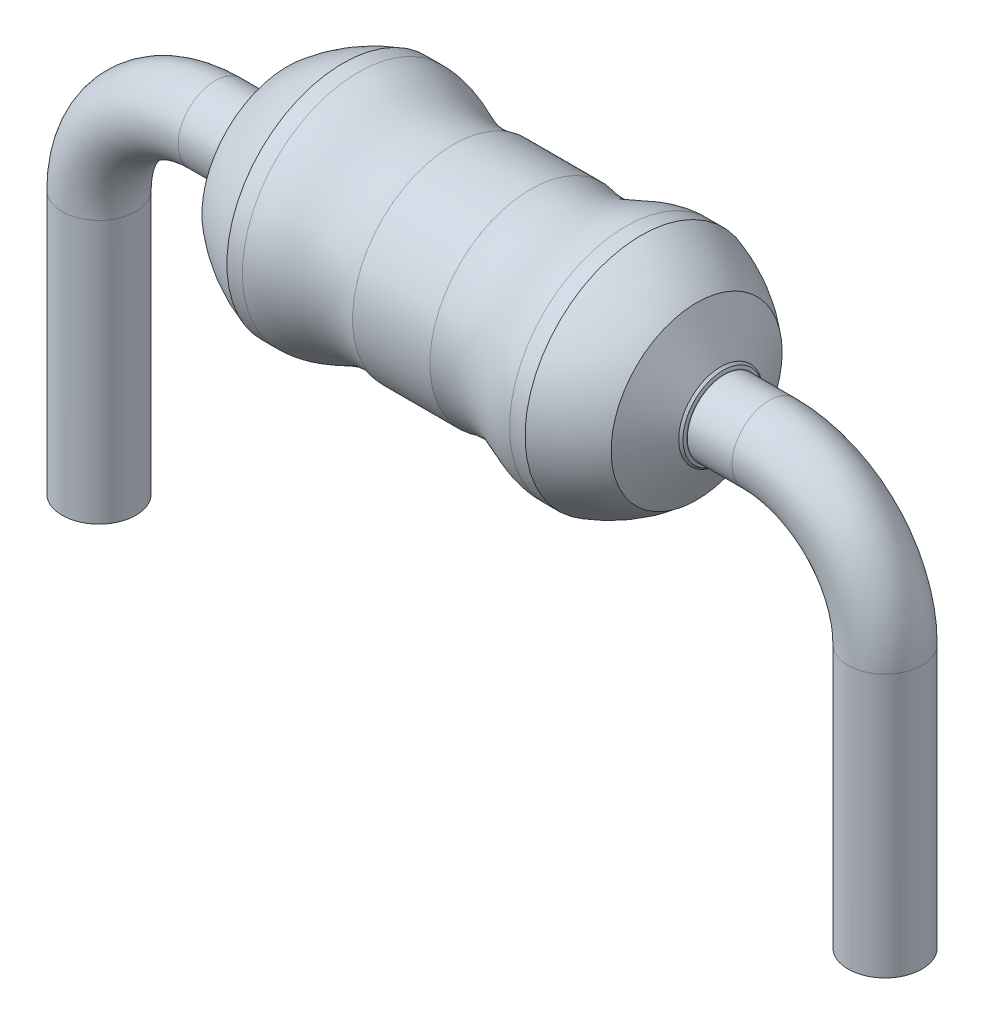
ISO-10303-21;
HEADER;
FILE_DESCRIPTION(('STEP AP214'),'2;1');
FILE_NAME('part.step','',(''),(''),'','','');
FILE_SCHEMA(('AUTOMOTIVE_DESIGN { 1 0 10303 214 1 1 1 1 }'));
ENDSEC;
DATA;
#1=APPLICATION_CONTEXT('core data for automotive mechanical design processes');
#2=APPLICATION_PROTOCOL_DEFINITION('international standard','automotive_design',2000,#1);
#3=PRODUCT_CONTEXT('',#1,'mechanical');
#4=PRODUCT('Part','Part','',(#3));
#5=PRODUCT_RELATED_PRODUCT_CATEGORY('part','',(#4));
#6=PRODUCT_DEFINITION_FORMATION('','',#4);
#7=PRODUCT_DEFINITION_CONTEXT('part definition',#1,'design');
#8=PRODUCT_DEFINITION('design','',#6,#7);
#9=PRODUCT_DEFINITION_SHAPE('','',#8);
#10=(LENGTH_UNIT() NAMED_UNIT(*) SI_UNIT(.MILLI.,.METRE.));
#11=(NAMED_UNIT(*) PLANE_ANGLE_UNIT() SI_UNIT($,.RADIAN.));
#12=(NAMED_UNIT(*) SI_UNIT($,.STERADIAN.) SOLID_ANGLE_UNIT());
#13=UNCERTAINTY_MEASURE_WITH_UNIT(LENGTH_MEASURE(1.E-05),#10,'distance_accuracy_value','');
#14=(GEOMETRIC_REPRESENTATION_CONTEXT(3) GLOBAL_UNCERTAINTY_ASSIGNED_CONTEXT((#13)) GLOBAL_UNIT_ASSIGNED_CONTEXT((#10,
#11,#12)) REPRESENTATION_CONTEXT('',''));
#15=CARTESIAN_POINT('',(0.,0.,0.));
#16=DIRECTION('',(0.,0.,1.));
#17=DIRECTION('',(1.,0.,0.));
#18=AXIS2_PLACEMENT_3D('',#15,#16,#17);
#19=CARTESIAN_POINT('',(-0.25,0.651526231351182,0.));
#20=CARTESIAN_POINT('',(-0.540627106576313,0.576942290694356,0.));
#21=CARTESIAN_POINT('',(-0.629755247804834,0.753539039726722,0.));
#22=CARTESIAN_POINT('',(-0.863389621188297,0.750000000000002,0.));
#23=B_SPLINE_CURVE_WITH_KNOTS('',3,(#19,#20,#21,#22),.UNSPECIFIED.,.F.,.F.,(4,4),
(0.141421900341974,1.),.UNSPECIFIED.);
#24=CARTESIAN_POINT('',(26.5291584484715,0.,0.));
#25=DIRECTION('',(1.,0.,0.));
#26=AXIS1_PLACEMENT('',#24,#25);
#27=SURFACE_OF_REVOLUTION('',#23,#26);
#28=CARTESIAN_POINT('',(-0.863389621188298,0.,0.));
#29=DIRECTION('',(1.,0.,0.));
#30=DIRECTION('',(0.,0.,-1.));
#31=AXIS2_PLACEMENT_3D('',#28,#29,#30);
#32=CIRCLE('',#31,0.75);
#33=CARTESIAN_POINT('',(-0.863389621188298,0.,-0.75));
#34=VERTEX_POINT('',#33);
#35=EDGE_CURVE('E53',#34,#34,#32,.T.);
#36=ORIENTED_EDGE('',*,*,#35,.T.);
#37=EDGE_LOOP('',(#36));
#38=FACE_BOUND('',#37,.T.);
#39=CARTESIAN_POINT('',(-0.25,0.,0.));
#40=DIRECTION('',(1.,0.,0.));
#41=DIRECTION('',(0.,0.,-1.));
#42=AXIS2_PLACEMENT_3D('',#39,#40,#41);
#43=CIRCLE('',#42,0.651526231351182);
#44=CARTESIAN_POINT('',(-0.25,0.,-0.651526231351182));
#45=VERTEX_POINT('',#44);
#46=EDGE_CURVE('E86',#45,#45,#43,.T.);
#47=ORIENTED_EDGE('',*,*,#46,.F.);
#48=EDGE_LOOP('',(#47));
#49=FACE_BOUND('',#48,.T.);
#50=ADVANCED_FACE('F33',(#38,#49),#27,.F.);
#51=CARTESIAN_POINT('',(26.5291584484715,0.,0.));
#52=DIRECTION('',(1.,0.,0.));
#53=DIRECTION('',(0.,0.,-1.));
#54=AXIS2_PLACEMENT_3D('',#51,#52,#53);
#55=CYLINDRICAL_SURFACE('',#54,0.75);
#56=CARTESIAN_POINT('',(-0.963389621188297,0.,0.));
#57=DIRECTION('',(1.,0.,0.));
#58=DIRECTION('',(0.,0.,-1.));
#59=AXIS2_PLACEMENT_3D('',#56,#57,#58);
#60=CIRCLE('',#59,0.75);
#61=CARTESIAN_POINT('',(-0.963389621188297,0.,-0.75));
#62=VERTEX_POINT('',#61);
#63=EDGE_CURVE('E56',#62,#62,#60,.T.);
#64=ORIENTED_EDGE('',*,*,#63,.T.);
#65=EDGE_LOOP('',(#64));
#66=FACE_BOUND('',#65,.T.);
#67=ORIENTED_EDGE('',*,*,#35,.F.);
#68=EDGE_LOOP('',(#67));
#69=FACE_BOUND('',#68,.T.);
#70=ADVANCED_FACE('F143',(#66,#69),#55,.T.);
#71=CARTESIAN_POINT('',(-0.645621937319628,0.,0.));
#72=DIRECTION('',(1.,0.,0.));
#73=DIRECTION('',(0.,0.,-1.));
#74=AXIS2_PLACEMENT_3D('',#71,#72,#73);
#75=DEGENERATE_TOROIDAL_SURFACE('',#74,0.253369807764226,1.05248623366013,.F.);
#76=CARTESIAN_POINT('',(-1.32233238501918,0.,0.));
#77=DIRECTION('',(1.,0.,0.));
#78=DIRECTION('',(0.,0.,-1.));
#79=AXIS2_PLACEMENT_3D('',#76,#77,#78);
#80=CIRCLE('',#79,0.552725870191158);
#81=CARTESIAN_POINT('',(-1.32233238501918,0.,-0.552725870191158));
#82=VERTEX_POINT('',#81);
#83=EDGE_CURVE('E59',#82,#82,#80,.T.);
#84=ORIENTED_EDGE('',*,*,#83,.T.);
#85=EDGE_LOOP('',(#84));
#86=FACE_BOUND('',#85,.T.);
#87=ORIENTED_EDGE('',*,*,#63,.F.);
#88=EDGE_LOOP('',(#87));
#89=FACE_BOUND('',#88,.T.);
#90=ADVANCED_FACE('F139',(#86,#89),#75,.F.);
#91=CARTESIAN_POINT('',(-1.32233238501918,0.,0.));
#92=DIRECTION('',(1.,0.,0.));
#93=DIRECTION('',(0.,0.,-1.));
#94=AXIS2_PLACEMENT_3D('',#91,#92,#93);
#95=CONICAL_SURFACE('',#94,0.552725870191158,1.06709591324831);
#96=CARTESIAN_POINT('',(-1.4775165691903,0.,0.));
#97=DIRECTION('',(1.,0.,0.));
#98=DIRECTION('',(0.,0.,-1.));
#99=AXIS2_PLACEMENT_3D('',#96,#97,#98);
#100=CIRCLE('',#99,0.271144690898735);
#101=CARTESIAN_POINT('',(-1.4775165691903,0.,-0.271144690898735));
#102=VERTEX_POINT('',#101);
#103=EDGE_CURVE('E62',#102,#102,#100,.T.);
#104=ORIENTED_EDGE('',*,*,#103,.T.);
#105=EDGE_LOOP('',(#104));
#106=FACE_BOUND('',#105,.T.);
#107=ORIENTED_EDGE('',*,*,#83,.F.);
#108=EDGE_LOOP('',(#107));
#109=FACE_BOUND('',#108,.T.);
#110=ADVANCED_FACE('F135',(#106,#109),#95,.T.);
#111=CARTESIAN_POINT('',(-1.78402789773097,0.,0.));
#112=DIRECTION('',(1.,0.,0.));
#113=DIRECTION('',(0.,0.,-1.));
#114=AXIS2_PLACEMENT_3D('',#111,#112,#113);
#115=TOROIDAL_SURFACE('',#114,0.623621218209544,0.467106943674412);
#116=CARTESIAN_POINT('',(-1.49253070357451,0.,0.));
#117=DIRECTION('',(1.,0.,0.));
#118=DIRECTION('',(0.,0.,-1.));
#119=AXIS2_PLACEMENT_3D('',#116,#117,#118);
#120=CIRCLE('',#119,0.25863042020532);
#121=CARTESIAN_POINT('',(-1.49253070357451,0.,-0.25863042020532));
#122=VERTEX_POINT('',#121);
#123=EDGE_CURVE('E65',#122,#122,#120,.T.);
#124=ORIENTED_EDGE('',*,*,#123,.T.);
#125=EDGE_LOOP('',(#124));
#126=FACE_BOUND('',#125,.T.);
#127=ORIENTED_EDGE('',*,*,#103,.F.);
#128=EDGE_LOOP('',(#127));
#129=FACE_BOUND('',#128,.T.);
#130=ADVANCED_FACE('F132',(#126,#129),#115,.F.);
#131=CARTESIAN_POINT('',(-1.49253070357451,0.,0.));
#132=DIRECTION('',(1.,0.,0.));
#133=DIRECTION('',(0.,0.,-1.));
#134=AXIS2_PLACEMENT_3D('',#131,#132,#133);
#135=CONICAL_SURFACE('',#134,0.25863042020532,1.18358948175056);
#136=CARTESIAN_POINT('',(-1.49925967375696,0.,0.));
#137=DIRECTION('',(-1.,0.,0.));
#138=DIRECTION('',(0.,0.,1.));
#139=AXIS2_PLACEMENT_3D('',#136,#137,#138);
#140=CIRCLE('',#139,0.242129496583466);
#141=CARTESIAN_POINT('',(-1.49925967375696,0.,0.242129496583466));
#142=VERTEX_POINT('',#141);
#143=EDGE_CURVE('E40',#142,#142,#140,.F.);
#144=ORIENTED_EDGE('',*,*,#143,.T.);
#145=EDGE_LOOP('',(#144));
#146=FACE_BOUND('',#145,.T.);
#147=ORIENTED_EDGE('',*,*,#123,.F.);
#148=EDGE_LOOP('',(#147));
#149=FACE_BOUND('',#148,.T.);
#150=ADVANCED_FACE('F128',(#146,#149),#135,.T.);
#151=CARTESIAN_POINT('',(1.5,0.,0.));
#152=DIRECTION('',(-1.,0.,0.));
#153=DIRECTION('',(0.,0.,1.));
#154=AXIS2_PLACEMENT_3D('',#151,#152,#153);
#155=CONICAL_SURFACE('',#154,0.240314052843878,1.18358948175056);
#156=CARTESIAN_POINT('',(1.49925967375696,0.,0.));
#157=DIRECTION('',(1.,0.,0.));
#158=DIRECTION('',(0.,0.,-1.));
#159=AXIS2_PLACEMENT_3D('',#156,#157,#158);
#160=CIRCLE('',#159,0.242129496583466);
#161=CARTESIAN_POINT('',(1.49925967375696,0.,-0.242129496583466));
#162=VERTEX_POINT('',#161);
#163=EDGE_CURVE('E44',#162,#162,#160,.F.);
#164=ORIENTED_EDGE('',*,*,#163,.T.);
#165=EDGE_LOOP('',(#164));
#166=FACE_BOUND('',#165,.T.);
#167=CARTESIAN_POINT('',(1.49253070357451,0.,0.));
#168=DIRECTION('',(1.,0.,0.));
#169=DIRECTION('',(0.,0.,-1.));
#170=AXIS2_PLACEMENT_3D('',#167,#168,#169);
#171=CIRCLE('',#170,0.25863042020532);
#172=CARTESIAN_POINT('',(1.49253070357451,0.,-0.25863042020532));
#173=VERTEX_POINT('',#172);
#174=EDGE_CURVE('E68',#173,#173,#171,.T.);
#175=ORIENTED_EDGE('',*,*,#174,.T.);
#176=EDGE_LOOP('',(#175));
#177=FACE_BOUND('',#176,.T.);
#178=ADVANCED_FACE('F124',(#166,#177),#155,.T.);
#179=CARTESIAN_POINT('',(1.78402789773097,0.,0.));
#180=DIRECTION('',(1.,0.,0.));
#181=DIRECTION('',(0.,0.,-1.));
#182=AXIS2_PLACEMENT_3D('',#179,#180,#181);
#183=TOROIDAL_SURFACE('',#182,0.623621218209544,0.467106943674412);
#184=CARTESIAN_POINT('',(1.4775165691903,0.,0.));
#185=DIRECTION('',(1.,0.,0.));
#186=DIRECTION('',(0.,0.,-1.));
#187=AXIS2_PLACEMENT_3D('',#184,#185,#186);
#188=CIRCLE('',#187,0.271144690898735);
#189=CARTESIAN_POINT('',(1.4775165691903,0.,-0.271144690898735));
#190=VERTEX_POINT('',#189);
#191=EDGE_CURVE('E71',#190,#190,#188,.T.);
#192=ORIENTED_EDGE('',*,*,#191,.T.);
#193=EDGE_LOOP('',(#192));
#194=FACE_BOUND('',#193,.T.);
#195=ORIENTED_EDGE('',*,*,#174,.F.);
#196=EDGE_LOOP('',(#195));
#197=FACE_BOUND('',#196,.T.);
#198=ADVANCED_FACE('F120',(#194,#197),#183,.F.);
#199=CARTESIAN_POINT('',(1.4775165691903,0.,0.));
#200=DIRECTION('',(-1.,0.,0.));
#201=DIRECTION('',(0.,0.,1.));
#202=AXIS2_PLACEMENT_3D('',#199,#200,#201);
#203=CONICAL_SURFACE('',#202,0.271144690898735,1.06709591324831);
#204=CARTESIAN_POINT('',(1.32233238501918,0.,0.));
#205=DIRECTION('',(1.,0.,0.));
#206=DIRECTION('',(0.,0.,-1.));
#207=AXIS2_PLACEMENT_3D('',#204,#205,#206);
#208=CIRCLE('',#207,0.552725870191158);
#209=CARTESIAN_POINT('',(1.32233238501918,0.,-0.552725870191158));
#210=VERTEX_POINT('',#209);
#211=EDGE_CURVE('E74',#210,#210,#208,.T.);
#212=ORIENTED_EDGE('',*,*,#211,.T.);
#213=EDGE_LOOP('',(#212));
#214=FACE_BOUND('',#213,.T.);
#215=ORIENTED_EDGE('',*,*,#191,.F.);
#216=EDGE_LOOP('',(#215));
#217=FACE_BOUND('',#216,.T.);
#218=ADVANCED_FACE('F116',(#214,#217),#203,.T.);
#219=CARTESIAN_POINT('',(0.645621937319628,0.,0.));
#220=DIRECTION('',(1.,0.,0.));
#221=DIRECTION('',(0.,0.,-1.));
#222=AXIS2_PLACEMENT_3D('',#219,#220,#221);
#223=DEGENERATE_TOROIDAL_SURFACE('',#222,0.253369807764226,1.05248623366013,.F.);
#224=CARTESIAN_POINT('',(0.963389621188297,0.,0.));
#225=DIRECTION('',(1.,0.,0.));
#226=DIRECTION('',(0.,0.,-1.));
#227=AXIS2_PLACEMENT_3D('',#224,#225,#226);
#228=CIRCLE('',#227,0.75);
#229=CARTESIAN_POINT('',(0.963389621188297,0.,-0.75));
#230=VERTEX_POINT('',#229);
#231=EDGE_CURVE('E77',#230,#230,#228,.T.);
#232=ORIENTED_EDGE('',*,*,#231,.T.);
#233=EDGE_LOOP('',(#232));
#234=FACE_BOUND('',#233,.T.);
#235=ORIENTED_EDGE('',*,*,#211,.F.);
#236=EDGE_LOOP('',(#235));
#237=FACE_BOUND('',#236,.T.);
#238=ADVANCED_FACE('F112',(#234,#237),#223,.F.);
#239=CARTESIAN_POINT('',(26.5291584484715,0.,0.));
#240=DIRECTION('',(1.,0.,0.));
#241=DIRECTION('',(0.,0.,-1.));
#242=AXIS2_PLACEMENT_3D('',#239,#240,#241);
#243=CYLINDRICAL_SURFACE('',#242,0.750000000000001);
#244=CARTESIAN_POINT('',(0.863389621188298,0.,0.));
#245=DIRECTION('',(1.,0.,0.));
#246=DIRECTION('',(0.,0.,-1.));
#247=AXIS2_PLACEMENT_3D('',#244,#245,#246);
#248=CIRCLE('',#247,0.750000000000001);
#249=CARTESIAN_POINT('',(0.863389621188298,0.,-0.750000000000001));
#250=VERTEX_POINT('',#249);
#251=EDGE_CURVE('E80',#250,#250,#248,.T.);
#252=ORIENTED_EDGE('',*,*,#251,.T.);
#253=EDGE_LOOP('',(#252));
#254=FACE_BOUND('',#253,.T.);
#255=ORIENTED_EDGE('',*,*,#231,.F.);
#256=EDGE_LOOP('',(#255));
#257=FACE_BOUND('',#256,.T.);
#258=ADVANCED_FACE('F107',(#254,#257),#243,.T.);
#259=CARTESIAN_POINT('',(0.863389621188297,0.750000000000001,0.));
#260=CARTESIAN_POINT('',(0.629755247804841,0.753539039726735,0.));
#261=CARTESIAN_POINT('',(0.540627106576319,0.576942290694364,0.));
#262=CARTESIAN_POINT('',(0.25,0.651526231351182,0.));
#263=B_SPLINE_CURVE_WITH_KNOTS('',3,(#259,#260,#261,#262),.UNSPECIFIED.,.F.,.F.,(4,4),
(0.141421900341976,1.),.UNSPECIFIED.);
#264=CARTESIAN_POINT('',(26.5291584484715,0.,0.));
#265=DIRECTION('',(1.,0.,0.));
#266=AXIS1_PLACEMENT('',#264,#265);
#267=SURFACE_OF_REVOLUTION('',#263,#266);
#268=CARTESIAN_POINT('',(0.25,0.,0.));
#269=DIRECTION('',(1.,0.,0.));
#270=DIRECTION('',(0.,0.,-1.));
#271=AXIS2_PLACEMENT_3D('',#268,#269,#270);
#272=CIRCLE('',#271,0.651526231351182);
#273=CARTESIAN_POINT('',(0.25,0.,-0.651526231351182));
#274=VERTEX_POINT('',#273);
#275=EDGE_CURVE('E83',#274,#274,#272,.T.);
#276=ORIENTED_EDGE('',*,*,#275,.T.);
#277=EDGE_LOOP('',(#276));
#278=FACE_BOUND('',#277,.T.);
#279=ORIENTED_EDGE('',*,*,#251,.F.);
#280=EDGE_LOOP('',(#279));
#281=FACE_BOUND('',#280,.T.);
#282=ADVANCED_FACE('F102',(#278,#281),#267,.F.);
#283=CARTESIAN_POINT('',(26.5291584484715,0.,0.));
#284=DIRECTION('',(1.,0.,0.));
#285=DIRECTION('',(0.,0.,-1.));
#286=AXIS2_PLACEMENT_3D('',#283,#284,#285);
#287=CYLINDRICAL_SURFACE('',#286,0.651526231351182);
#288=ORIENTED_EDGE('',*,*,#46,.T.);
#289=EDGE_LOOP('',(#288));
#290=FACE_BOUND('',#289,.T.);
#291=ORIENTED_EDGE('',*,*,#275,.F.);
#292=EDGE_LOOP('',(#291));
#293=FACE_BOUND('',#292,.T.);
#294=ADVANCED_FACE('F106',(#290,#293),#287,.T.);
#295=CARTESIAN_POINT('',(1.49,0.,0.));
#296=DIRECTION('',(1.,0.,0.));
#297=DIRECTION('',(0.,0.,-1.));
#298=AXIS2_PLACEMENT_3D('',#295,#296,#297);
#299=TOROIDAL_SURFACE('',#298,0.238353461372481,0.01);
#300=ORIENTED_EDGE('',*,*,#163,.F.);
#301=EDGE_LOOP('',(#300));
#302=FACE_BOUND('',#301,.T.);
#303=CARTESIAN_POINT('',(1.5,0.,0.));
#304=DIRECTION('',(1.,0.,0.));
#305=DIRECTION('',(0.,0.,-1.));
#306=AXIS2_PLACEMENT_3D('',#303,#304,#305);
#307=CIRCLE('',#306,0.238353461372481);
#308=CARTESIAN_POINT('',(1.5,0.,-0.238353461372481));
#309=VERTEX_POINT('',#308);
#310=EDGE_CURVE('E48',#309,#309,#307,.T.);
#311=ORIENTED_EDGE('',*,*,#310,.F.);
#312=EDGE_LOOP('',(#311));
#313=FACE_BOUND('',#312,.T.);
#314=ADVANCED_FACE('F150',(#302,#313),#299,.T.);
#315=CARTESIAN_POINT('',(-1.49,0.,0.));
#316=DIRECTION('',(-1.,0.,0.));
#317=DIRECTION('',(0.,0.,1.));
#318=AXIS2_PLACEMENT_3D('',#315,#316,#317);
#319=TOROIDAL_SURFACE('',#318,0.238353461372481,0.01);
#320=CARTESIAN_POINT('',(-1.5,0.,0.));
#321=DIRECTION('',(-1.,0.,0.));
#322=DIRECTION('',(0.,0.,1.));
#323=AXIS2_PLACEMENT_3D('',#320,#321,#322);
#324=CIRCLE('',#323,0.238353461372481);
#325=CARTESIAN_POINT('',(-1.5,0.,0.238353461372481));
#326=VERTEX_POINT('',#325);
#327=EDGE_CURVE('E10',#326,#326,#324,.T.);
#328=ORIENTED_EDGE('',*,*,#327,.F.);
#329=EDGE_LOOP('',(#328));
#330=FACE_BOUND('',#329,.T.);
#331=ORIENTED_EDGE('',*,*,#143,.F.);
#332=EDGE_LOOP('',(#331));
#333=FACE_BOUND('',#332,.T.);
#334=ADVANCED_FACE('F35',(#330,#333),#319,.T.);
#335=CARTESIAN_POINT('',(2.54,-2.45,0.));
#336=DIRECTION('',(0.,-1.,0.));
#337=DIRECTION('',(0.,0.,-1.));
#338=AXIS2_PLACEMENT_3D('',#335,#336,#337);
#339=PLANE('',#338);
#340=CARTESIAN_POINT('',(2.54,-2.45,0.));
#341=DIRECTION('',(0.,-1.,0.));
#342=DIRECTION('',(0.,0.,-1.));
#343=AXIS2_PLACEMENT_3D('',#340,#341,#342);
#344=CIRCLE('',#343,0.238353461372481);
#345=CARTESIAN_POINT('',(2.54,-2.45,-0.238353461372481));
#346=VERTEX_POINT('',#345);
#347=EDGE_CURVE('E89',#346,#346,#344,.T.);
#348=ORIENTED_EDGE('',*,*,#347,.T.);
#349=EDGE_LOOP('',(#348));
#350=FACE_BOUND('',#349,.T.);
#351=ADVANCED_FACE('F157',(#350),#339,.T.);
#352=CARTESIAN_POINT('',(1.5,0.,0.));
#353=DIRECTION('',(1.,0.,0.));
#354=DIRECTION('',(0.,0.,-1.));
#355=AXIS2_PLACEMENT_3D('',#352,#353,#354);
#356=CYLINDRICAL_SURFACE('',#355,0.238353461372481);
#357=CARTESIAN_POINT('',(1.79,0.,0.));
#358=DIRECTION('',(1.,0.,0.));
#359=DIRECTION('',(0.,0.,-1.));
#360=AXIS2_PLACEMENT_3D('',#357,#358,#359);
#361=CIRCLE('',#360,0.238353461372481);
#362=CARTESIAN_POINT('',(1.79,0.238353461372481,0.));
#363=VERTEX_POINT('',#362);
#364=EDGE_CURVE('E196',#363,#363,#361,.T.);
#365=ORIENTED_EDGE('',*,*,#364,.F.);
#366=EDGE_LOOP('',(#365));
#367=FACE_BOUND('',#366,.T.);
#368=ORIENTED_EDGE('',*,*,#310,.T.);
#369=EDGE_LOOP('',(#368));
#370=FACE_BOUND('',#369,.T.);
#371=ADVANCED_FACE('F165',(#367,#370),#356,.T.);
#372=CARTESIAN_POINT('',(1.79,-0.75,0.));
#373=DIRECTION('',(0.,0.,-1.));
#374=DIRECTION('',(-1.,0.,0.));
#375=AXIS2_PLACEMENT_3D('',#372,#373,#374);
#376=TOROIDAL_SURFACE('',#375,0.75,0.238353461372481);
#377=CARTESIAN_POINT('',(2.54,-0.75,0.));
#378=DIRECTION('',(0.,-1.,0.));
#379=DIRECTION('',(0.,0.,-1.));
#380=AXIS2_PLACEMENT_3D('',#377,#378,#379);
#381=CIRCLE('',#380,0.238353461372481);
#382=CARTESIAN_POINT('',(2.77835346137248,-0.75,0.));
#383=VERTEX_POINT('',#382);
#384=EDGE_CURVE('E195',#383,#383,#381,.T.);
#385=CARTESIAN_POINT('',(1.79,-0.75,0.));
#386=DIRECTION('',(0.,0.,-1.));
#387=DIRECTION('',(-1.,0.,0.));
#388=AXIS2_PLACEMENT_3D('',#385,#386,#387);
#389=CIRCLE('',#388,0.988353461372481);
#390=EDGE_CURVE('',#363,#383,#389,.T.);
#391=ORIENTED_EDGE('',*,*,#364,.T.);
#392=ORIENTED_EDGE('',*,*,#384,.F.);
#393=ORIENTED_EDGE('',*,*,#390,.T.);
#394=ORIENTED_EDGE('',*,*,#390,.F.);
#395=EDGE_LOOP('',(#391,#393,#392,#394));
#396=FACE_BOUND('',#395,.T.);
#397=ADVANCED_FACE('F167',(#396),#376,.T.);
#398=CARTESIAN_POINT('',(2.54,-0.75,0.));
#399=DIRECTION('',(0.,-1.,0.));
#400=DIRECTION('',(1.,0.,0.));
#401=AXIS2_PLACEMENT_3D('',#398,#399,#400);
#402=CYLINDRICAL_SURFACE('',#401,0.238353461372481);
#403=ORIENTED_EDGE('',*,*,#347,.F.);
#404=EDGE_LOOP('',(#403));
#405=FACE_BOUND('',#404,.T.);
#406=ORIENTED_EDGE('',*,*,#384,.T.);
#407=EDGE_LOOP('',(#406));
#408=FACE_BOUND('',#407,.T.);
#409=ADVANCED_FACE('F159',(#405,#408),#402,.T.);
#410=CARTESIAN_POINT('',(-2.54,-2.45,0.));
#411=DIRECTION('',(0.,-1.,0.));
#412=DIRECTION('',(0.,0.,-1.));
#413=AXIS2_PLACEMENT_3D('',#410,#411,#412);
#414=PLANE('',#413);
#415=CARTESIAN_POINT('',(-2.54,-2.45,0.));
#416=DIRECTION('',(0.,1.,0.));
#417=DIRECTION('',(0.,0.,-1.));
#418=AXIS2_PLACEMENT_3D('',#415,#416,#417);
#419=CIRCLE('',#418,0.238353461372481);
#420=CARTESIAN_POINT('',(-2.54,-2.45,-0.238353461372481));
#421=VERTEX_POINT('',#420);
#422=EDGE_CURVE('E199',#421,#421,#419,.F.);
#423=ORIENTED_EDGE('',*,*,#422,.T.);
#424=EDGE_LOOP('',(#423));
#425=FACE_BOUND('',#424,.T.);
#426=ADVANCED_FACE('F180',(#425),#414,.T.);
#427=CARTESIAN_POINT('',(-1.5,0.,0.));
#428=DIRECTION('',(-1.,0.,0.));
#429=DIRECTION('',(0.,0.,1.));
#430=AXIS2_PLACEMENT_3D('',#427,#428,#429);
#431=CYLINDRICAL_SURFACE('',#430,0.238353461372481);
#432=CARTESIAN_POINT('',(-1.79,0.,0.));
#433=DIRECTION('',(1.,0.,0.));
#434=DIRECTION('',(0.,0.,-1.));
#435=AXIS2_PLACEMENT_3D('',#432,#433,#434);
#436=CIRCLE('',#435,0.238353461372481);
#437=CARTESIAN_POINT('',(-1.79,0.238353461372481,0.));
#438=VERTEX_POINT('',#437);
#439=EDGE_CURVE('E207',#438,#438,#436,.F.);
#440=ORIENTED_EDGE('',*,*,#439,.F.);
#441=EDGE_LOOP('',(#440));
#442=FACE_BOUND('',#441,.T.);
#443=ORIENTED_EDGE('',*,*,#327,.T.);
#444=EDGE_LOOP('',(#443));
#445=FACE_BOUND('',#444,.T.);
#446=ADVANCED_FACE('F188',(#442,#445),#431,.T.);
#447=CARTESIAN_POINT('',(-1.79,-0.75,0.));
#448=DIRECTION('',(0.,0.,1.));
#449=DIRECTION('',(1.,0.,0.));
#450=AXIS2_PLACEMENT_3D('',#447,#448,#449);
#451=TOROIDAL_SURFACE('',#450,0.75,0.238353461372481);
#452=CARTESIAN_POINT('',(-2.54,-0.75,0.));
#453=DIRECTION('',(0.,1.,0.));
#454=DIRECTION('',(0.,0.,-1.));
#455=AXIS2_PLACEMENT_3D('',#452,#453,#454);
#456=CIRCLE('',#455,0.238353461372481);
#457=CARTESIAN_POINT('',(-2.77835346137248,-0.75,0.));
#458=VERTEX_POINT('',#457);
#459=EDGE_CURVE('E204',#458,#458,#456,.F.);
#460=CARTESIAN_POINT('',(-1.79,-0.75,0.));
#461=DIRECTION('',(0.,0.,1.));
#462=DIRECTION('',(1.,0.,0.));
#463=AXIS2_PLACEMENT_3D('',#460,#461,#462);
#464=CIRCLE('',#463,0.988353461372481);
#465=EDGE_CURVE('',#438,#458,#464,.T.);
#466=ORIENTED_EDGE('',*,*,#439,.T.);
#467=ORIENTED_EDGE('',*,*,#459,.F.);
#468=ORIENTED_EDGE('',*,*,#465,.T.);
#469=ORIENTED_EDGE('',*,*,#465,.F.);
#470=EDGE_LOOP('',(#466,#468,#467,#469));
#471=FACE_BOUND('',#470,.T.);
#472=ADVANCED_FACE('F211',(#471),#451,.T.);
#473=CARTESIAN_POINT('',(-2.54,-0.75,0.));
#474=DIRECTION('',(0.,-1.,0.));
#475=DIRECTION('',(1.,0.,0.));
#476=AXIS2_PLACEMENT_3D('',#473,#474,#475);
#477=CYLINDRICAL_SURFACE('',#476,0.238353461372481);
#478=ORIENTED_EDGE('',*,*,#422,.F.);
#479=EDGE_LOOP('',(#478));
#480=FACE_BOUND('',#479,.T.);
#481=ORIENTED_EDGE('',*,*,#459,.T.);
#482=EDGE_LOOP('',(#481));
#483=FACE_BOUND('',#482,.T.);
#484=ADVANCED_FACE('F177',(#480,#483),#477,.T.);
#485=CLOSED_SHELL('',(#50,#70,#90,#110,#130,#150,#178,#198,#218,#238,#258,#282,#294,#314,#334,
#351,#371,#397,#409,#426,#446,#472,#484));
#486=MANIFOLD_SOLID_BREP('B2',#485);
#487=ADVANCED_BREP_SHAPE_REPRESENTATION('',(#18,#486),#14);
#488=SHAPE_DEFINITION_REPRESENTATION(#9,#487);
ENDSEC;
END-ISO-10303-21;
